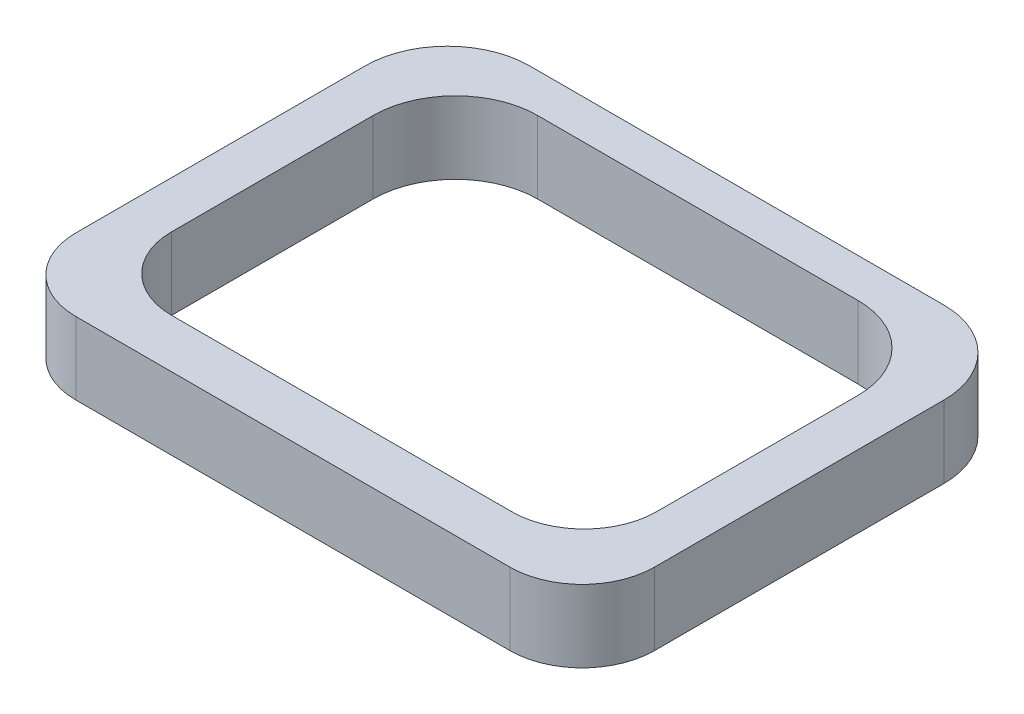
ISO-10303-21;
HEADER;
FILE_DESCRIPTION(('STEP AP214'),'2;1');
FILE_NAME('part.step','',(''),(''),'','','');
FILE_SCHEMA(('AUTOMOTIVE_DESIGN { 1 0 10303 214 1 1 1 1 }'));
ENDSEC;
DATA;
#1=APPLICATION_CONTEXT('core data for automotive mechanical design processes');
#2=APPLICATION_PROTOCOL_DEFINITION('international standard','automotive_design',2000,#1);
#3=PRODUCT_CONTEXT('',#1,'mechanical');
#4=PRODUCT('Part','Part','',(#3));
#5=PRODUCT_RELATED_PRODUCT_CATEGORY('part','',(#4));
#6=PRODUCT_DEFINITION_FORMATION('','',#4);
#7=PRODUCT_DEFINITION_CONTEXT('part definition',#1,'design');
#8=PRODUCT_DEFINITION('design','',#6,#7);
#9=PRODUCT_DEFINITION_SHAPE('','',#8);
#10=(LENGTH_UNIT() NAMED_UNIT(*) SI_UNIT(.MILLI.,.METRE.));
#11=(NAMED_UNIT(*) PLANE_ANGLE_UNIT() SI_UNIT($,.RADIAN.));
#12=(NAMED_UNIT(*) SI_UNIT($,.STERADIAN.) SOLID_ANGLE_UNIT());
#13=UNCERTAINTY_MEASURE_WITH_UNIT(LENGTH_MEASURE(1.E-05),#10,'distance_accuracy_value','');
#14=(GEOMETRIC_REPRESENTATION_CONTEXT(3) GLOBAL_UNCERTAINTY_ASSIGNED_CONTEXT((#13)) GLOBAL_UNIT_ASSIGNED_CONTEXT((#10,
#11,#12)) REPRESENTATION_CONTEXT('',''));
#15=CARTESIAN_POINT('',(0.,0.,0.));
#16=DIRECTION('',(0.,0.,1.));
#17=DIRECTION('',(1.,0.,0.));
#18=AXIS2_PLACEMENT_3D('',#15,#16,#17);
#19=CARTESIAN_POINT('',(85.8999999999999,30.,-57.95));
#20=DIRECTION('',(0.,-1.,0.));
#21=DIRECTION('',(0.,0.,-1.));
#22=AXIS2_PLACEMENT_3D('',#19,#20,#21);
#23=PLANE('',#22);
#24=CARTESIAN_POINT('',(85.8999999999999,30.,-57.95));
#25=DIRECTION('',(0.,1.,0.));
#26=DIRECTION('',(0.,0.,-1.));
#27=AXIS2_PLACEMENT_3D('',#24,#25,#26);
#28=CIRCLE('',#27,34.1);
#29=CARTESIAN_POINT('',(120.,30.,-57.95));
#30=VERTEX_POINT('',#29);
#31=CARTESIAN_POINT('',(85.8999999999999,30.,-92.05));
#32=VERTEX_POINT('',#31);
#33=EDGE_CURVE('E242',#30,#32,#28,.T.);
#34=ORIENTED_EDGE('',*,*,#33,.T.);
#35=DIRECTION('',(-1.,0.,0.));
#36=VECTOR('',#35,1.);
#37=CARTESIAN_POINT('',(-85.8999999999999,30.,-92.05));
#38=LINE('',#37,#36);
#39=CARTESIAN_POINT('',(-85.8999999999999,30.,-92.05));
#40=VERTEX_POINT('',#39);
#41=EDGE_CURVE('E246',#32,#40,#38,.T.);
#42=ORIENTED_EDGE('',*,*,#41,.T.);
#43=CARTESIAN_POINT('',(-85.8999999999999,30.,-57.95));
#44=DIRECTION('',(0.,1.,0.));
#45=DIRECTION('',(0.,0.,1.));
#46=AXIS2_PLACEMENT_3D('',#43,#44,#45);
#47=CIRCLE('',#46,34.1);
#48=CARTESIAN_POINT('',(-120.,30.,-57.95));
#49=VERTEX_POINT('',#48);
#50=EDGE_CURVE('E250',#40,#49,#47,.T.);
#51=ORIENTED_EDGE('',*,*,#50,.T.);
#52=DIRECTION('',(0.,0.,1.));
#53=VECTOR('',#52,1.);
#54=CARTESIAN_POINT('',(-120.,30.,-57.95));
#55=LINE('',#54,#53);
#56=CARTESIAN_POINT('',(-120.,30.,62.05));
#57=VERTEX_POINT('',#56);
#58=EDGE_CURVE('E253',#49,#57,#55,.T.);
#59=ORIENTED_EDGE('',*,*,#58,.T.);
#60=CARTESIAN_POINT('',(-90.,30.,62.0500000000001));
#61=DIRECTION('',(0.,1.,0.));
#62=DIRECTION('',(0.,0.,1.));
#63=AXIS2_PLACEMENT_3D('',#60,#61,#62);
#64=CIRCLE('',#63,30.);
#65=CARTESIAN_POINT('',(-90.,30.,92.05));
#66=VERTEX_POINT('',#65);
#67=EDGE_CURVE('E256',#57,#66,#64,.T.);
#68=ORIENTED_EDGE('',*,*,#67,.T.);
#69=DIRECTION('',(1.,0.,0.));
#70=VECTOR('',#69,1.);
#71=CARTESIAN_POINT('',(-90.,30.,92.05));
#72=LINE('',#71,#70);
#73=CARTESIAN_POINT('',(90.,30.,92.0499999999999));
#74=VERTEX_POINT('',#73);
#75=EDGE_CURVE('E259',#66,#74,#72,.T.);
#76=ORIENTED_EDGE('',*,*,#75,.T.);
#77=CARTESIAN_POINT('',(90.,30.,62.05));
#78=DIRECTION('',(0.,1.,0.));
#79=DIRECTION('',(0.,0.,1.));
#80=AXIS2_PLACEMENT_3D('',#77,#78,#79);
#81=CIRCLE('',#80,29.9999999999999);
#82=CARTESIAN_POINT('',(120.,30.,62.05));
#83=VERTEX_POINT('',#82);
#84=EDGE_CURVE('E262',#74,#83,#81,.T.);
#85=ORIENTED_EDGE('',*,*,#84,.T.);
#86=DIRECTION('',(0.,0.,-1.));
#87=VECTOR('',#86,1.);
#88=CARTESIAN_POINT('',(120.,30.,-57.95));
#89=LINE('',#88,#87);
#90=EDGE_CURVE('E265',#83,#30,#89,.T.);
#91=ORIENTED_EDGE('',*,*,#90,.T.);
#92=EDGE_LOOP('',(#34,#42,#51,#59,#68,#76,#85,#91));
#93=FACE_BOUND('',#92,.T.);
#94=CARTESIAN_POINT('',(66.4276695296637,30.,-41.7803390593275));
#95=DIRECTION('',(0.,1.,0.));
#96=DIRECTION('',(0.,0.,-1.));
#97=AXIS2_PLACEMENT_3D('',#94,#95,#96);
#98=CIRCLE('',#97,34.1);
#99=CARTESIAN_POINT('',(100.527669529664,30.,-41.7803390593274));
#100=VERTEX_POINT('',#99);
#101=CARTESIAN_POINT('',(66.4276695296637,30.,-75.8803390593274));
#102=VERTEX_POINT('',#101);
#103=EDGE_CURVE('E153',#100,#102,#98,.T.);
#104=ORIENTED_EDGE('',*,*,#103,.F.);
#105=DIRECTION('',(0.,0.,-1.));
#106=VECTOR('',#105,1.);
#107=CARTESIAN_POINT('',(100.527669529664,30.,-41.7803390593274));
#108=LINE('',#107,#106);
#109=CARTESIAN_POINT('',(100.527669529664,30.,41.7803390593274));
#110=VERTEX_POINT('',#109);
#111=EDGE_CURVE('E194',#110,#100,#108,.T.);
#112=ORIENTED_EDGE('',*,*,#111,.F.);
#113=CARTESIAN_POINT('',(70.5276695296638,30.,41.7803390593274));
#114=DIRECTION('',(0.,1.,0.));
#115=DIRECTION('',(0.,0.,1.));
#116=AXIS2_PLACEMENT_3D('',#113,#114,#115);
#117=CIRCLE('',#116,30.);
#118=CARTESIAN_POINT('',(70.5276695296638,30.,71.7803390593273));
#119=VERTEX_POINT('',#118);
#120=EDGE_CURVE('E191',#119,#110,#117,.T.);
#121=ORIENTED_EDGE('',*,*,#120,.F.);
#122=DIRECTION('',(1.,0.,0.));
#123=VECTOR('',#122,1.);
#124=CARTESIAN_POINT('',(-70.5276695296637,30.,71.7803390593274));
#125=LINE('',#124,#123);
#126=CARTESIAN_POINT('',(-70.5276695296637,30.,71.7803390593274));
#127=VERTEX_POINT('',#126);
#128=EDGE_CURVE('E188',#127,#119,#125,.T.);
#129=ORIENTED_EDGE('',*,*,#128,.F.);
#130=CARTESIAN_POINT('',(-70.5276695296637,30.,41.7803390593274));
#131=DIRECTION('',(0.,1.,0.));
#132=DIRECTION('',(0.,0.,1.));
#133=AXIS2_PLACEMENT_3D('',#130,#131,#132);
#134=CIRCLE('',#133,29.9999999999999);
#135=CARTESIAN_POINT('',(-100.527669529664,30.,41.7803390593274));
#136=VERTEX_POINT('',#135);
#137=EDGE_CURVE('E185',#136,#127,#134,.T.);
#138=ORIENTED_EDGE('',*,*,#137,.F.);
#139=DIRECTION('',(0.,0.,1.));
#140=VECTOR('',#139,1.);
#141=CARTESIAN_POINT('',(-100.527669529664,30.,-41.7803390593274));
#142=LINE('',#141,#140);
#143=CARTESIAN_POINT('',(-100.527669529664,30.,-41.7803390593274));
#144=VERTEX_POINT('',#143);
#145=EDGE_CURVE('E180',#144,#136,#142,.T.);
#146=ORIENTED_EDGE('',*,*,#145,.F.);
#147=CARTESIAN_POINT('',(-66.4276695296637,30.,-41.7803390593274));
#148=DIRECTION('',(0.,1.,0.));
#149=DIRECTION('',(0.,0.,1.));
#150=AXIS2_PLACEMENT_3D('',#147,#148,#149);
#151=CIRCLE('',#150,34.1);
#152=CARTESIAN_POINT('',(-66.4276695296637,30.,-75.8803390593274));
#153=VERTEX_POINT('',#152);
#154=EDGE_CURVE('E176',#153,#144,#151,.T.);
#155=ORIENTED_EDGE('',*,*,#154,.F.);
#156=DIRECTION('',(-1.,0.,0.));
#157=VECTOR('',#156,1.);
#158=CARTESIAN_POINT('',(-66.4276695296637,30.,-75.8803390593274));
#159=LINE('',#158,#157);
#160=EDGE_CURVE('E162',#102,#153,#159,.T.);
#161=ORIENTED_EDGE('',*,*,#160,.F.);
#162=EDGE_LOOP('',(#104,#112,#121,#129,#138,#146,#155,#161));
#163=FACE_BOUND('',#162,.T.);
#164=ADVANCED_FACE('F39',(#93,#163),#23,.F.);
#165=CARTESIAN_POINT('',(85.8999999999999,0.,-57.95));
#166=DIRECTION('',(0.,-1.,0.));
#167=DIRECTION('',(0.,0.,-1.));
#168=AXIS2_PLACEMENT_3D('',#165,#166,#167);
#169=PLANE('',#168);
#170=CARTESIAN_POINT('',(85.8999999999999,0.,-57.95));
#171=DIRECTION('',(0.,1.,0.));
#172=DIRECTION('',(0.,0.,-1.));
#173=AXIS2_PLACEMENT_3D('',#170,#171,#172);
#174=CIRCLE('',#173,34.1);
#175=CARTESIAN_POINT('',(120.,0.,-57.95));
#176=VERTEX_POINT('',#175);
#177=CARTESIAN_POINT('',(85.8999999999999,0.,-92.05));
#178=VERTEX_POINT('',#177);
#179=EDGE_CURVE('E171',#176,#178,#174,.T.);
#180=ORIENTED_EDGE('',*,*,#179,.F.);
#181=DIRECTION('',(0.,0.,-1.));
#182=VECTOR('',#181,1.);
#183=CARTESIAN_POINT('',(120.,0.,-57.95));
#184=LINE('',#183,#182);
#185=CARTESIAN_POINT('',(120.,0.,62.05));
#186=VERTEX_POINT('',#185);
#187=EDGE_CURVE('E247',#186,#176,#184,.T.);
#188=ORIENTED_EDGE('',*,*,#187,.F.);
#189=CARTESIAN_POINT('',(90.,0.,62.05));
#190=DIRECTION('',(0.,1.,0.));
#191=DIRECTION('',(0.,0.,1.));
#192=AXIS2_PLACEMENT_3D('',#189,#190,#191);
#193=CIRCLE('',#192,29.9999999999999);
#194=CARTESIAN_POINT('',(90.,0.,92.0499999999999));
#195=VERTEX_POINT('',#194);
#196=EDGE_CURVE('E287',#195,#186,#193,.T.);
#197=ORIENTED_EDGE('',*,*,#196,.F.);
#198=DIRECTION('',(1.,0.,0.));
#199=VECTOR('',#198,1.);
#200=CARTESIAN_POINT('',(-90.,0.,92.05));
#201=LINE('',#200,#199);
#202=CARTESIAN_POINT('',(-90.,0.,92.05));
#203=VERTEX_POINT('',#202);
#204=EDGE_CURVE('E284',#203,#195,#201,.T.);
#205=ORIENTED_EDGE('',*,*,#204,.F.);
#206=CARTESIAN_POINT('',(-90.,0.,62.0500000000001));
#207=DIRECTION('',(0.,1.,0.));
#208=DIRECTION('',(0.,0.,1.));
#209=AXIS2_PLACEMENT_3D('',#206,#207,#208);
#210=CIRCLE('',#209,30.);
#211=CARTESIAN_POINT('',(-120.,0.,62.05));
#212=VERTEX_POINT('',#211);
#213=EDGE_CURVE('E281',#212,#203,#210,.T.);
#214=ORIENTED_EDGE('',*,*,#213,.F.);
#215=DIRECTION('',(0.,0.,1.));
#216=VECTOR('',#215,1.);
#217=CARTESIAN_POINT('',(-120.,0.,-57.95));
#218=LINE('',#217,#216);
#219=CARTESIAN_POINT('',(-120.,0.,-57.95));
#220=VERTEX_POINT('',#219);
#221=EDGE_CURVE('E278',#220,#212,#218,.T.);
#222=ORIENTED_EDGE('',*,*,#221,.F.);
#223=CARTESIAN_POINT('',(-85.8999999999999,0.,-57.95));
#224=DIRECTION('',(0.,1.,0.));
#225=DIRECTION('',(0.,0.,1.));
#226=AXIS2_PLACEMENT_3D('',#223,#224,#225);
#227=CIRCLE('',#226,34.1);
#228=CARTESIAN_POINT('',(-85.8999999999999,0.,-92.05));
#229=VERTEX_POINT('',#228);
#230=EDGE_CURVE('E275',#229,#220,#227,.T.);
#231=ORIENTED_EDGE('',*,*,#230,.F.);
#232=DIRECTION('',(-1.,0.,0.));
#233=VECTOR('',#232,1.);
#234=CARTESIAN_POINT('',(-85.8999999999999,0.,-92.05));
#235=LINE('',#234,#233);
#236=EDGE_CURVE('E272',#178,#229,#235,.T.);
#237=ORIENTED_EDGE('',*,*,#236,.F.);
#238=EDGE_LOOP('',(#180,#188,#197,#205,#214,#222,#231,#237));
#239=FACE_BOUND('',#238,.T.);
#240=DIRECTION('',(0.,0.,-1.));
#241=VECTOR('',#240,1.);
#242=CARTESIAN_POINT('',(100.527669529664,0.,-41.7803390593274));
#243=LINE('',#242,#241);
#244=CARTESIAN_POINT('',(100.527669529664,0.,41.7803390593274));
#245=VERTEX_POINT('',#244);
#246=CARTESIAN_POINT('',(100.527669529664,0.,-41.7803390593274));
#247=VERTEX_POINT('',#246);
#248=EDGE_CURVE('E163',#245,#247,#243,.T.);
#249=ORIENTED_EDGE('',*,*,#248,.T.);
#250=CARTESIAN_POINT('',(66.4276695296637,0.,-41.7803390593275));
#251=DIRECTION('',(0.,1.,0.));
#252=DIRECTION('',(0.,0.,-1.));
#253=AXIS2_PLACEMENT_3D('',#250,#251,#252);
#254=CIRCLE('',#253,34.1);
#255=CARTESIAN_POINT('',(66.4276695296637,0.,-75.8803390593274));
#256=VERTEX_POINT('',#255);
#257=EDGE_CURVE('E63',#247,#256,#254,.T.);
#258=ORIENTED_EDGE('',*,*,#257,.T.);
#259=DIRECTION('',(-1.,0.,0.));
#260=VECTOR('',#259,1.);
#261=CARTESIAN_POINT('',(-66.4276695296637,0.,-75.8803390593274));
#262=LINE('',#261,#260);
#263=CARTESIAN_POINT('',(-66.4276695296637,0.,-75.8803390593274));
#264=VERTEX_POINT('',#263);
#265=EDGE_CURVE('E169',#256,#264,#262,.T.);
#266=ORIENTED_EDGE('',*,*,#265,.T.);
#267=CARTESIAN_POINT('',(-66.4276695296637,0.,-41.7803390593274));
#268=DIRECTION('',(0.,1.,0.));
#269=DIRECTION('',(0.,0.,1.));
#270=AXIS2_PLACEMENT_3D('',#267,#268,#269);
#271=CIRCLE('',#270,34.1);
#272=CARTESIAN_POINT('',(-100.527669529664,0.,-41.7803390593274));
#273=VERTEX_POINT('',#272);
#274=EDGE_CURVE('E201',#264,#273,#271,.T.);
#275=ORIENTED_EDGE('',*,*,#274,.T.);
#276=DIRECTION('',(0.,0.,1.));
#277=VECTOR('',#276,1.);
#278=CARTESIAN_POINT('',(-100.527669529664,0.,-41.7803390593274));
#279=LINE('',#278,#277);
#280=CARTESIAN_POINT('',(-100.527669529664,0.,41.7803390593274));
#281=VERTEX_POINT('',#280);
#282=EDGE_CURVE('E205',#273,#281,#279,.T.);
#283=ORIENTED_EDGE('',*,*,#282,.T.);
#284=CARTESIAN_POINT('',(-70.5276695296637,0.,41.7803390593274));
#285=DIRECTION('',(0.,1.,0.));
#286=DIRECTION('',(0.,0.,1.));
#287=AXIS2_PLACEMENT_3D('',#284,#285,#286);
#288=CIRCLE('',#287,29.9999999999999);
#289=CARTESIAN_POINT('',(-70.5276695296637,0.,71.7803390593274));
#290=VERTEX_POINT('',#289);
#291=EDGE_CURVE('E209',#281,#290,#288,.T.);
#292=ORIENTED_EDGE('',*,*,#291,.T.);
#293=DIRECTION('',(1.,0.,0.));
#294=VECTOR('',#293,1.);
#295=CARTESIAN_POINT('',(-70.5276695296637,0.,71.7803390593274));
#296=LINE('',#295,#294);
#297=CARTESIAN_POINT('',(70.5276695296638,0.,71.7803390593273));
#298=VERTEX_POINT('',#297);
#299=EDGE_CURVE('E213',#290,#298,#296,.T.);
#300=ORIENTED_EDGE('',*,*,#299,.T.);
#301=CARTESIAN_POINT('',(70.5276695296638,0.,41.7803390593274));
#302=DIRECTION('',(0.,1.,0.));
#303=DIRECTION('',(0.,0.,1.));
#304=AXIS2_PLACEMENT_3D('',#301,#302,#303);
#305=CIRCLE('',#304,30.);
#306=EDGE_CURVE('E217',#298,#245,#305,.T.);
#307=ORIENTED_EDGE('',*,*,#306,.T.);
#308=EDGE_LOOP('',(#249,#258,#266,#275,#283,#292,#300,#307));
#309=FACE_BOUND('',#308,.T.);
#310=ADVANCED_FACE('F326',(#239,#309),#169,.T.);
#311=CARTESIAN_POINT('',(85.8999999999999,30.,-57.95));
#312=DIRECTION('',(0.,-1.,0.));
#313=DIRECTION('',(0.,0.,-1.));
#314=AXIS2_PLACEMENT_3D('',#311,#312,#313);
#315=CYLINDRICAL_SURFACE('',#314,34.1);
#316=ORIENTED_EDGE('',*,*,#179,.T.);
#317=DIRECTION('',(0.,-1.,0.));
#318=VECTOR('',#317,1.);
#319=CARTESIAN_POINT('',(85.8999999999999,30.,-92.05));
#320=LINE('',#319,#318);
#321=EDGE_CURVE('E11',#32,#178,#320,.T.);
#322=ORIENTED_EDGE('',*,*,#321,.F.);
#323=ORIENTED_EDGE('',*,*,#33,.F.);
#324=DIRECTION('',(0.,-1.,0.));
#325=VECTOR('',#324,1.);
#326=CARTESIAN_POINT('',(120.,30.,-57.95));
#327=LINE('',#326,#325);
#328=EDGE_CURVE('E268',#30,#176,#327,.T.);
#329=ORIENTED_EDGE('',*,*,#328,.T.);
#330=EDGE_LOOP('',(#316,#322,#323,#329));
#331=FACE_BOUND('',#330,.T.);
#332=ADVANCED_FACE('F41',(#331),#315,.T.);
#333=CARTESIAN_POINT('',(-85.8999999999999,30.,-92.05));
#334=DIRECTION('',(0.,0.,1.));
#335=DIRECTION('',(1.,0.,0.));
#336=AXIS2_PLACEMENT_3D('',#333,#334,#335);
#337=PLANE('',#336);
#338=ORIENTED_EDGE('',*,*,#236,.T.);
#339=DIRECTION('',(0.,-1.,0.));
#340=VECTOR('',#339,1.);
#341=CARTESIAN_POINT('',(-85.8999999999999,30.,-92.05));
#342=LINE('',#341,#340);
#343=EDGE_CURVE('E48',#40,#229,#342,.T.);
#344=ORIENTED_EDGE('',*,*,#343,.F.);
#345=ORIENTED_EDGE('',*,*,#41,.F.);
#346=ORIENTED_EDGE('',*,*,#321,.T.);
#347=EDGE_LOOP('',(#338,#344,#345,#346));
#348=FACE_BOUND('',#347,.T.);
#349=ADVANCED_FACE('F343',(#348),#337,.F.);
#350=CARTESIAN_POINT('',(-85.8999999999999,30.,-57.95));
#351=DIRECTION('',(0.,-1.,0.));
#352=DIRECTION('',(0.,0.,-1.));
#353=AXIS2_PLACEMENT_3D('',#350,#351,#352);
#354=CYLINDRICAL_SURFACE('',#353,34.1);
#355=ORIENTED_EDGE('',*,*,#230,.T.);
#356=DIRECTION('',(0.,-1.,0.));
#357=VECTOR('',#356,1.);
#358=CARTESIAN_POINT('',(-120.,30.,-57.95));
#359=LINE('',#358,#357);
#360=EDGE_CURVE('E311',#49,#220,#359,.T.);
#361=ORIENTED_EDGE('',*,*,#360,.F.);
#362=ORIENTED_EDGE('',*,*,#50,.F.);
#363=ORIENTED_EDGE('',*,*,#343,.T.);
#364=EDGE_LOOP('',(#355,#361,#362,#363));
#365=FACE_BOUND('',#364,.T.);
#366=ADVANCED_FACE('F320',(#365),#354,.T.);
#367=CARTESIAN_POINT('',(-120.,30.,-57.95));
#368=DIRECTION('',(1.,0.,0.));
#369=DIRECTION('',(0.,0.,-1.));
#370=AXIS2_PLACEMENT_3D('',#367,#368,#369);
#371=PLANE('',#370);
#372=ORIENTED_EDGE('',*,*,#221,.T.);
#373=DIRECTION('',(0.,-1.,0.));
#374=VECTOR('',#373,1.);
#375=CARTESIAN_POINT('',(-120.,30.,62.05));
#376=LINE('',#375,#374);
#377=EDGE_CURVE('E307',#57,#212,#376,.T.);
#378=ORIENTED_EDGE('',*,*,#377,.F.);
#379=ORIENTED_EDGE('',*,*,#58,.F.);
#380=ORIENTED_EDGE('',*,*,#360,.T.);
#381=EDGE_LOOP('',(#372,#378,#379,#380));
#382=FACE_BOUND('',#381,.T.);
#383=ADVANCED_FACE('F332',(#382),#371,.F.);
#384=CARTESIAN_POINT('',(-90.,30.,62.0500000000001));
#385=DIRECTION('',(0.,-1.,0.));
#386=DIRECTION('',(0.,0.,-1.));
#387=AXIS2_PLACEMENT_3D('',#384,#385,#386);
#388=CYLINDRICAL_SURFACE('',#387,30.);
#389=ORIENTED_EDGE('',*,*,#213,.T.);
#390=DIRECTION('',(0.,-1.,0.));
#391=VECTOR('',#390,1.);
#392=CARTESIAN_POINT('',(-90.,30.,92.05));
#393=LINE('',#392,#391);
#394=EDGE_CURVE('E303',#66,#203,#393,.T.);
#395=ORIENTED_EDGE('',*,*,#394,.F.);
#396=ORIENTED_EDGE('',*,*,#67,.F.);
#397=ORIENTED_EDGE('',*,*,#377,.T.);
#398=EDGE_LOOP('',(#389,#395,#396,#397));
#399=FACE_BOUND('',#398,.T.);
#400=ADVANCED_FACE('F336',(#399),#388,.T.);
#401=CARTESIAN_POINT('',(-90.,30.,92.05));
#402=DIRECTION('',(0.,0.,-1.));
#403=DIRECTION('',(-1.,0.,0.));
#404=AXIS2_PLACEMENT_3D('',#401,#402,#403);
#405=PLANE('',#404);
#406=ORIENTED_EDGE('',*,*,#204,.T.);
#407=DIRECTION('',(0.,-1.,0.));
#408=VECTOR('',#407,1.);
#409=CARTESIAN_POINT('',(90.,30.,92.0499999999999));
#410=LINE('',#409,#408);
#411=EDGE_CURVE('E299',#74,#195,#410,.T.);
#412=ORIENTED_EDGE('',*,*,#411,.F.);
#413=ORIENTED_EDGE('',*,*,#75,.F.);
#414=ORIENTED_EDGE('',*,*,#394,.T.);
#415=EDGE_LOOP('',(#406,#412,#413,#414));
#416=FACE_BOUND('',#415,.T.);
#417=ADVANCED_FACE('F356',(#416),#405,.F.);
#418=CARTESIAN_POINT('',(90.,30.,62.05));
#419=DIRECTION('',(0.,-1.,0.));
#420=DIRECTION('',(0.,0.,-1.));
#421=AXIS2_PLACEMENT_3D('',#418,#419,#420);
#422=CYLINDRICAL_SURFACE('',#421,29.9999999999999);
#423=ORIENTED_EDGE('',*,*,#196,.T.);
#424=DIRECTION('',(0.,-1.,0.));
#425=VECTOR('',#424,1.);
#426=CARTESIAN_POINT('',(120.,30.,62.05));
#427=LINE('',#426,#425);
#428=EDGE_CURVE('E295',#83,#186,#427,.T.);
#429=ORIENTED_EDGE('',*,*,#428,.F.);
#430=ORIENTED_EDGE('',*,*,#84,.F.);
#431=ORIENTED_EDGE('',*,*,#411,.T.);
#432=EDGE_LOOP('',(#423,#429,#430,#431));
#433=FACE_BOUND('',#432,.T.);
#434=ADVANCED_FACE('F354',(#433),#422,.T.);
#435=CARTESIAN_POINT('',(120.,30.,-57.95));
#436=DIRECTION('',(-1.,0.,0.));
#437=DIRECTION('',(0.,0.,1.));
#438=AXIS2_PLACEMENT_3D('',#435,#436,#437);
#439=PLANE('',#438);
#440=ORIENTED_EDGE('',*,*,#187,.T.);
#441=ORIENTED_EDGE('',*,*,#328,.F.);
#442=ORIENTED_EDGE('',*,*,#90,.F.);
#443=ORIENTED_EDGE('',*,*,#428,.T.);
#444=EDGE_LOOP('',(#440,#441,#442,#443));
#445=FACE_BOUND('',#444,.T.);
#446=ADVANCED_FACE('F349',(#445),#439,.F.);
#447=CARTESIAN_POINT('',(66.4276695296637,30.,-41.7803390593275));
#448=DIRECTION('',(0.,-1.,0.));
#449=DIRECTION('',(0.,0.,-1.));
#450=AXIS2_PLACEMENT_3D('',#447,#448,#449);
#451=CYLINDRICAL_SURFACE('',#450,34.1);
#452=ORIENTED_EDGE('',*,*,#257,.F.);
#453=DIRECTION('',(0.,-1.,0.));
#454=VECTOR('',#453,1.);
#455=CARTESIAN_POINT('',(100.527669529664,30.,-41.7803390593274));
#456=LINE('',#455,#454);
#457=EDGE_CURVE('E157',#100,#247,#456,.T.);
#458=ORIENTED_EDGE('',*,*,#457,.F.);
#459=ORIENTED_EDGE('',*,*,#103,.T.);
#460=DIRECTION('',(0.,-1.,0.));
#461=VECTOR('',#460,1.);
#462=CARTESIAN_POINT('',(66.4276695296637,30.,-75.8803390593274));
#463=LINE('',#462,#461);
#464=EDGE_CURVE('E156',#102,#256,#463,.T.);
#465=ORIENTED_EDGE('',*,*,#464,.T.);
#466=EDGE_LOOP('',(#452,#458,#459,#465));
#467=FACE_BOUND('',#466,.T.);
#468=ADVANCED_FACE('F155',(#467),#451,.F.);
#469=CARTESIAN_POINT('',(-66.4276695296637,30.,-75.8803390593274));
#470=DIRECTION('',(0.,0.,1.));
#471=DIRECTION('',(1.,0.,0.));
#472=AXIS2_PLACEMENT_3D('',#469,#470,#471);
#473=PLANE('',#472);
#474=ORIENTED_EDGE('',*,*,#265,.F.);
#475=ORIENTED_EDGE('',*,*,#464,.F.);
#476=ORIENTED_EDGE('',*,*,#160,.T.);
#477=DIRECTION('',(0.,-1.,0.));
#478=VECTOR('',#477,1.);
#479=CARTESIAN_POINT('',(-66.4276695296637,30.,-75.8803390593274));
#480=LINE('',#479,#478);
#481=EDGE_CURVE('E172',#153,#264,#480,.T.);
#482=ORIENTED_EDGE('',*,*,#481,.T.);
#483=EDGE_LOOP('',(#474,#475,#476,#482));
#484=FACE_BOUND('',#483,.T.);
#485=ADVANCED_FACE('F166',(#484),#473,.T.);
#486=CARTESIAN_POINT('',(-66.4276695296637,30.,-41.7803390593274));
#487=DIRECTION('',(0.,-1.,0.));
#488=DIRECTION('',(0.,0.,-1.));
#489=AXIS2_PLACEMENT_3D('',#486,#487,#488);
#490=CYLINDRICAL_SURFACE('',#489,34.1);
#491=ORIENTED_EDGE('',*,*,#274,.F.);
#492=ORIENTED_EDGE('',*,*,#481,.F.);
#493=ORIENTED_EDGE('',*,*,#154,.T.);
#494=DIRECTION('',(0.,-1.,0.));
#495=VECTOR('',#494,1.);
#496=CARTESIAN_POINT('',(-100.527669529664,30.,-41.7803390593274));
#497=LINE('',#496,#495);
#498=EDGE_CURVE('E237',#144,#273,#497,.T.);
#499=ORIENTED_EDGE('',*,*,#498,.T.);
#500=EDGE_LOOP('',(#491,#492,#493,#499));
#501=FACE_BOUND('',#500,.T.);
#502=ADVANCED_FACE('F381',(#501),#490,.F.);
#503=CARTESIAN_POINT('',(-100.527669529664,30.,-41.7803390593274));
#504=DIRECTION('',(1.,0.,0.));
#505=DIRECTION('',(0.,0.,-1.));
#506=AXIS2_PLACEMENT_3D('',#503,#504,#505);
#507=PLANE('',#506);
#508=ORIENTED_EDGE('',*,*,#282,.F.);
#509=ORIENTED_EDGE('',*,*,#498,.F.);
#510=ORIENTED_EDGE('',*,*,#145,.T.);
#511=DIRECTION('',(0.,-1.,0.));
#512=VECTOR('',#511,1.);
#513=CARTESIAN_POINT('',(-100.527669529664,30.,41.7803390593274));
#514=LINE('',#513,#512);
#515=EDGE_CURVE('E234',#136,#281,#514,.T.);
#516=ORIENTED_EDGE('',*,*,#515,.T.);
#517=EDGE_LOOP('',(#508,#509,#510,#516));
#518=FACE_BOUND('',#517,.T.);
#519=ADVANCED_FACE('F385',(#518),#507,.T.);
#520=CARTESIAN_POINT('',(-70.5276695296637,30.,41.7803390593274));
#521=DIRECTION('',(0.,-1.,0.));
#522=DIRECTION('',(0.,0.,-1.));
#523=AXIS2_PLACEMENT_3D('',#520,#521,#522);
#524=CYLINDRICAL_SURFACE('',#523,29.9999999999999);
#525=ORIENTED_EDGE('',*,*,#291,.F.);
#526=ORIENTED_EDGE('',*,*,#515,.F.);
#527=ORIENTED_EDGE('',*,*,#137,.T.);
#528=DIRECTION('',(0.,-1.,0.));
#529=VECTOR('',#528,1.);
#530=CARTESIAN_POINT('',(-70.5276695296637,30.,71.7803390593274));
#531=LINE('',#530,#529);
#532=EDGE_CURVE('E231',#127,#290,#531,.T.);
#533=ORIENTED_EDGE('',*,*,#532,.T.);
#534=EDGE_LOOP('',(#525,#526,#527,#533));
#535=FACE_BOUND('',#534,.T.);
#536=ADVANCED_FACE('F391',(#535),#524,.F.);
#537=CARTESIAN_POINT('',(-70.5276695296637,30.,71.7803390593274));
#538=DIRECTION('',(0.,0.,-1.));
#539=DIRECTION('',(-1.,0.,0.));
#540=AXIS2_PLACEMENT_3D('',#537,#538,#539);
#541=PLANE('',#540);
#542=ORIENTED_EDGE('',*,*,#299,.F.);
#543=ORIENTED_EDGE('',*,*,#532,.F.);
#544=ORIENTED_EDGE('',*,*,#128,.T.);
#545=DIRECTION('',(0.,-1.,0.));
#546=VECTOR('',#545,1.);
#547=CARTESIAN_POINT('',(70.5276695296638,30.,71.7803390593273));
#548=LINE('',#547,#546);
#549=EDGE_CURVE('E228',#119,#298,#548,.T.);
#550=ORIENTED_EDGE('',*,*,#549,.T.);
#551=EDGE_LOOP('',(#542,#543,#544,#550));
#552=FACE_BOUND('',#551,.T.);
#553=ADVANCED_FACE('F395',(#552),#541,.T.);
#554=CARTESIAN_POINT('',(70.5276695296638,30.,41.7803390593274));
#555=DIRECTION('',(0.,-1.,0.));
#556=DIRECTION('',(0.,0.,-1.));
#557=AXIS2_PLACEMENT_3D('',#554,#555,#556);
#558=CYLINDRICAL_SURFACE('',#557,30.);
#559=ORIENTED_EDGE('',*,*,#306,.F.);
#560=ORIENTED_EDGE('',*,*,#549,.F.);
#561=ORIENTED_EDGE('',*,*,#120,.T.);
#562=DIRECTION('',(0.,-1.,0.));
#563=VECTOR('',#562,1.);
#564=CARTESIAN_POINT('',(100.527669529664,30.,41.7803390593274));
#565=LINE('',#564,#563);
#566=EDGE_CURVE('E55',#110,#245,#565,.T.);
#567=ORIENTED_EDGE('',*,*,#566,.T.);
#568=EDGE_LOOP('',(#559,#560,#561,#567));
#569=FACE_BOUND('',#568,.T.);
#570=ADVANCED_FACE('F399',(#569),#558,.F.);
#571=CARTESIAN_POINT('',(100.527669529664,30.,-41.7803390593274));
#572=DIRECTION('',(-1.,0.,0.));
#573=DIRECTION('',(0.,0.,1.));
#574=AXIS2_PLACEMENT_3D('',#571,#572,#573);
#575=PLANE('',#574);
#576=ORIENTED_EDGE('',*,*,#248,.F.);
#577=ORIENTED_EDGE('',*,*,#566,.F.);
#578=ORIENTED_EDGE('',*,*,#111,.T.);
#579=ORIENTED_EDGE('',*,*,#457,.T.);
#580=EDGE_LOOP('',(#576,#577,#578,#579));
#581=FACE_BOUND('',#580,.T.);
#582=ADVANCED_FACE('F403',(#581),#575,.T.);
#583=CLOSED_SHELL('',(#164,#310,#332,#349,#366,#383,#400,#417,#434,#446,#468,#485,#502,#519,
#536,#553,#570,#582));
#584=MANIFOLD_SOLID_BREP('B2',#583);
#585=ADVANCED_BREP_SHAPE_REPRESENTATION('',(#18,#584),#14);
#586=SHAPE_DEFINITION_REPRESENTATION(#9,#585);
ENDSEC;
END-ISO-10303-21;
